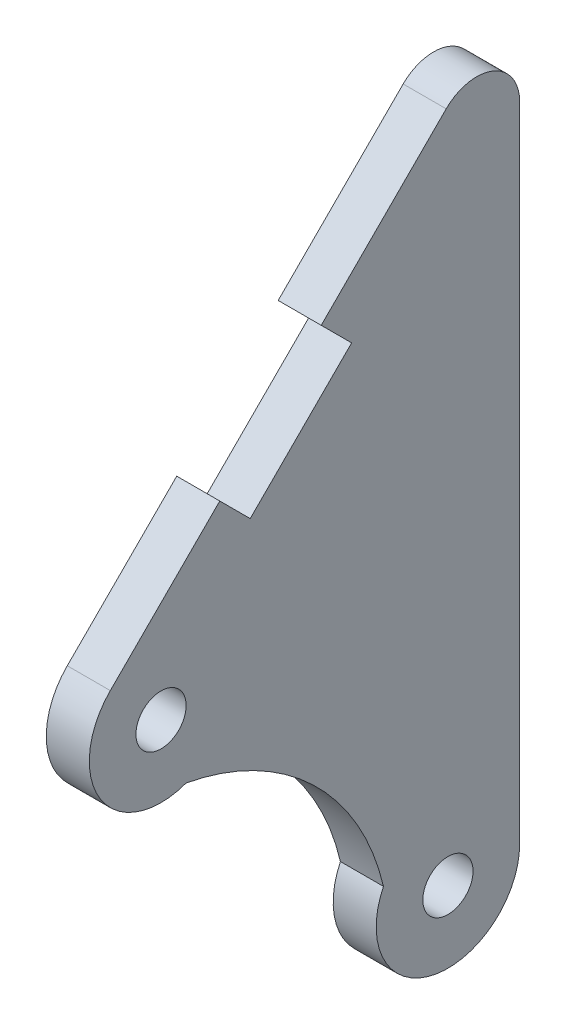
ISO-10303-21;
HEADER;
FILE_DESCRIPTION(('STEP AP214'),'2;1');
FILE_NAME('part.step','',(''),(''),'','','');
FILE_SCHEMA(('AUTOMOTIVE_DESIGN { 1 0 10303 214 1 1 1 1 }'));
ENDSEC;
DATA;
#1=APPLICATION_CONTEXT('core data for automotive mechanical design processes');
#2=APPLICATION_PROTOCOL_DEFINITION('international standard','automotive_design',2000,#1);
#3=PRODUCT_CONTEXT('',#1,'mechanical');
#4=PRODUCT('Part','Part','',(#3));
#5=PRODUCT_RELATED_PRODUCT_CATEGORY('part','',(#4));
#6=PRODUCT_DEFINITION_FORMATION('','',#4);
#7=PRODUCT_DEFINITION_CONTEXT('part definition',#1,'design');
#8=PRODUCT_DEFINITION('design','',#6,#7);
#9=PRODUCT_DEFINITION_SHAPE('','',#8);
#10=(LENGTH_UNIT() NAMED_UNIT(*) SI_UNIT(.MILLI.,.METRE.));
#11=(NAMED_UNIT(*) PLANE_ANGLE_UNIT() SI_UNIT($,.RADIAN.));
#12=(NAMED_UNIT(*) SI_UNIT($,.STERADIAN.) SOLID_ANGLE_UNIT());
#13=UNCERTAINTY_MEASURE_WITH_UNIT(LENGTH_MEASURE(1.E-05),#10,'distance_accuracy_value','');
#14=(GEOMETRIC_REPRESENTATION_CONTEXT(3) GLOBAL_UNCERTAINTY_ASSIGNED_CONTEXT((#13)) GLOBAL_UNIT_ASSIGNED_CONTEXT((#10,
#11,#12)) REPRESENTATION_CONTEXT('',''));
#15=CARTESIAN_POINT('',(0.,0.,0.));
#16=DIRECTION('',(0.,0.,1.));
#17=DIRECTION('',(1.,0.,0.));
#18=AXIS2_PLACEMENT_3D('',#15,#16,#17);
#19=CARTESIAN_POINT('',(3.,20.,20.));
#20=DIRECTION('',(1.,0.,0.));
#21=DIRECTION('',(0.,0.,-1.));
#22=AXIS2_PLACEMENT_3D('',#19,#20,#21);
#23=PLANE('',#22);
#24=CARTESIAN_POINT('',(3.,0.,0.));
#25=DIRECTION('',(1.,0.,0.));
#26=DIRECTION('',(0.,0.,-1.));
#27=AXIS2_PLACEMENT_3D('',#24,#25,#26);
#28=CIRCLE('',#27,1.75);
#29=CARTESIAN_POINT('',(3.,0.,-1.75));
#30=VERTEX_POINT('',#29);
#31=EDGE_CURVE('E145',#30,#30,#28,.T.);
#32=ORIENTED_EDGE('',*,*,#31,.F.);
#33=EDGE_LOOP('',(#32));
#34=FACE_BOUND('',#33,.T.);
#35=CARTESIAN_POINT('',(3.,20.,20.));
#36=DIRECTION('',(1.,0.,0.));
#37=DIRECTION('',(0.,0.,-1.));
#38=AXIS2_PLACEMENT_3D('',#35,#36,#37);
#39=CIRCLE('',#38,5.);
#40=CARTESIAN_POINT('',(3.,23.5355339059327,23.5355339059328));
#41=VERTEX_POINT('',#40);
#42=CARTESIAN_POINT('',(3.,15.3140869019712,18.255804357957));
#43=VERTEX_POINT('',#42);
#44=EDGE_CURVE('E160',#41,#43,#39,.T.);
#45=ORIENTED_EDGE('',*,*,#44,.T.);
#46=CARTESIAN_POINT('',(3.,-1.81136084238303,21.4472512237101));
#47=DIRECTION('',(-1.,0.,0.));
#48=DIRECTION('',(0.,0.,1.));
#49=AXIS2_PLACEMENT_3D('',#46,#47,#48);
#50=CIRCLE('',#49,17.4202839684528);
#51=CARTESIAN_POINT('',(3.,2.19294795151884,4.49343735707191));
#52=VERTEX_POINT('',#51);
#53=EDGE_CURVE('E98',#43,#52,#50,.T.);
#54=ORIENTED_EDGE('',*,*,#53,.T.);
#55=CARTESIAN_POINT('',(3.,0.,0.));
#56=DIRECTION('',(1.,0.,0.));
#57=DIRECTION('',(0.,0.,-1.));
#58=AXIS2_PLACEMENT_3D('',#55,#56,#57);
#59=CIRCLE('',#58,5.);
#60=CARTESIAN_POINT('',(3.,0.,-5.));
#61=VERTEX_POINT('',#60);
#62=EDGE_CURVE('E181',#52,#61,#59,.T.);
#63=ORIENTED_EDGE('',*,*,#62,.T.);
#64=DIRECTION('',(0.,1.,0.));
#65=VECTOR('',#64,1.);
#66=CARTESIAN_POINT('',(3.,44.8284271247464,-5.));
#67=LINE('',#66,#65);
#68=CARTESIAN_POINT('',(3.,44.8284271247464,-5.));
#69=VERTEX_POINT('',#68);
#70=EDGE_CURVE('E200',#61,#69,#67,.T.);
#71=ORIENTED_EDGE('',*,*,#70,.T.);
#72=CARTESIAN_POINT('',(3.,44.8284271247464,-2.));
#73=DIRECTION('',(1.,0.,0.));
#74=DIRECTION('',(0.,0.,-1.));
#75=AXIS2_PLACEMENT_3D('',#72,#73,#74);
#76=CIRCLE('',#75,3.00000000000001);
#77=CARTESIAN_POINT('',(3.,46.9497474683061,0.121320343559651));
#78=VERTEX_POINT('',#77);
#79=EDGE_CURVE('E197',#69,#78,#76,.T.);
#80=ORIENTED_EDGE('',*,*,#79,.T.);
#81=DIRECTION('',(0.,-0.707106781186552,0.707106781186543));
#82=VECTOR('',#81,1.);
#83=CARTESIAN_POINT('',(3.,38.2371973138897,8.83387049797595));
#84=LINE('',#83,#82);
#85=CARTESIAN_POINT('',(3.,38.2371973138897,8.83387049797595));
#86=VERTEX_POINT('',#85);
#87=EDGE_CURVE('E199',#78,#86,#84,.T.);
#88=ORIENTED_EDGE('',*,*,#87,.T.);
#89=DIRECTION('',(0.,-0.707106781186549,-0.707106781186547));
#90=VECTOR('',#89,1.);
#91=CARTESIAN_POINT('',(3.,36.11587697033,6.71255015441624));
#92=LINE('',#91,#90);
#93=CARTESIAN_POINT('',(3.,36.11587697033,6.71255015441624));
#94=VERTEX_POINT('',#93);
#95=EDGE_CURVE('E123',#86,#94,#92,.T.);
#96=ORIENTED_EDGE('',*,*,#95,.T.);
#97=DIRECTION('',(0.,-0.707106781186547,0.707106781186548));
#98=VECTOR('',#97,1.);
#99=CARTESIAN_POINT('',(3.,29.0448091584645,13.7836179662817));
#100=LINE('',#99,#98);
#101=CARTESIAN_POINT('',(3.,29.0448091584645,13.7836179662817));
#102=VERTEX_POINT('',#101);
#103=EDGE_CURVE('E117',#94,#102,#100,.T.);
#104=ORIENTED_EDGE('',*,*,#103,.T.);
#105=DIRECTION('',(0.,0.707106781186548,0.707106781186548));
#106=VECTOR('',#105,1.);
#107=CARTESIAN_POINT('',(3.,29.0448091584645,13.7836179662817));
#108=LINE('',#107,#106);
#109=CARTESIAN_POINT('',(3.,31.1661295020242,15.9049383098414));
#110=VERTEX_POINT('',#109);
#111=EDGE_CURVE('E121',#102,#110,#108,.T.);
#112=ORIENTED_EDGE('',*,*,#111,.T.);
#113=DIRECTION('',(0.,-0.707106781186551,0.707106781186544));
#114=VECTOR('',#113,1.);
#115=CARTESIAN_POINT('',(3.,23.5355339059327,23.5355339059328));
#116=LINE('',#115,#114);
#117=EDGE_CURVE('E49',#110,#41,#116,.T.);
#118=ORIENTED_EDGE('',*,*,#117,.T.);
#119=EDGE_LOOP('',(#45,#54,#63,#71,#80,#88,#96,#104,#112,#118));
#120=FACE_BOUND('',#119,.T.);
#121=CARTESIAN_POINT('',(3.,20.,20.));
#122=DIRECTION('',(1.,0.,0.));
#123=DIRECTION('',(0.,0.,-1.));
#124=AXIS2_PLACEMENT_3D('',#121,#122,#123);
#125=CIRCLE('',#124,1.75);
#126=CARTESIAN_POINT('',(3.,20.,18.25));
#127=VERTEX_POINT('',#126);
#128=EDGE_CURVE('E211',#127,#127,#125,.T.);
#129=ORIENTED_EDGE('',*,*,#128,.F.);
#130=EDGE_LOOP('',(#129));
#131=FACE_BOUND('',#130,.T.);
#132=ADVANCED_FACE('F32',(#34,#120,#131),#23,.T.);
#133=CARTESIAN_POINT('',(0.,20.,20.));
#134=DIRECTION('',(1.,0.,0.));
#135=DIRECTION('',(0.,0.,-1.));
#136=AXIS2_PLACEMENT_3D('',#133,#134,#135);
#137=PLANE('',#136);
#138=CARTESIAN_POINT('',(0.,0.,0.));
#139=DIRECTION('',(1.,0.,0.));
#140=DIRECTION('',(0.,0.,-1.));
#141=AXIS2_PLACEMENT_3D('',#138,#139,#140);
#142=CIRCLE('',#141,1.75);
#143=CARTESIAN_POINT('',(0.,0.,-1.75));
#144=VERTEX_POINT('',#143);
#145=EDGE_CURVE('E208',#144,#144,#142,.T.);
#146=ORIENTED_EDGE('',*,*,#145,.T.);
#147=EDGE_LOOP('',(#146));
#148=FACE_BOUND('',#147,.T.);
#149=CARTESIAN_POINT('',(0.,20.,20.));
#150=DIRECTION('',(1.,0.,0.));
#151=DIRECTION('',(0.,0.,-1.));
#152=AXIS2_PLACEMENT_3D('',#149,#150,#151);
#153=CIRCLE('',#152,5.);
#154=CARTESIAN_POINT('',(0.,23.5355339059327,23.5355339059328));
#155=VERTEX_POINT('',#154);
#156=CARTESIAN_POINT('',(0.,15.3140869019712,18.255804357957));
#157=VERTEX_POINT('',#156);
#158=EDGE_CURVE('E141',#155,#157,#153,.T.);
#159=ORIENTED_EDGE('',*,*,#158,.F.);
#160=DIRECTION('',(0.,-0.707106781186551,0.707106781186544));
#161=VECTOR('',#160,1.);
#162=CARTESIAN_POINT('',(0.,23.5355339059327,23.5355339059328));
#163=LINE('',#162,#161);
#164=CARTESIAN_POINT('',(0.,31.1661295020242,15.9049383098414));
#165=VERTEX_POINT('',#164);
#166=EDGE_CURVE('E90',#165,#155,#163,.T.);
#167=ORIENTED_EDGE('',*,*,#166,.F.);
#168=DIRECTION('',(0.,0.707106781186548,0.707106781186548));
#169=VECTOR('',#168,1.);
#170=CARTESIAN_POINT('',(0.,29.0448091584645,13.7836179662817));
#171=LINE('',#170,#169);
#172=CARTESIAN_POINT('',(0.,29.0448091584645,13.7836179662817));
#173=VERTEX_POINT('',#172);
#174=EDGE_CURVE('E84',#173,#165,#171,.T.);
#175=ORIENTED_EDGE('',*,*,#174,.F.);
#176=DIRECTION('',(0.,-0.707106781186547,0.707106781186548));
#177=VECTOR('',#176,1.);
#178=CARTESIAN_POINT('',(0.,29.0448091584645,13.7836179662817));
#179=LINE('',#178,#177);
#180=CARTESIAN_POINT('',(0.,36.11587697033,6.71255015441624));
#181=VERTEX_POINT('',#180);
#182=EDGE_CURVE('E131',#181,#173,#179,.T.);
#183=ORIENTED_EDGE('',*,*,#182,.F.);
#184=DIRECTION('',(0.,-0.707106781186549,-0.707106781186547));
#185=VECTOR('',#184,1.);
#186=CARTESIAN_POINT('',(0.,36.11587697033,6.71255015441624));
#187=LINE('',#186,#185);
#188=CARTESIAN_POINT('',(0.,38.2371973138897,8.83387049797595));
#189=VERTEX_POINT('',#188);
#190=EDGE_CURVE('E155',#189,#181,#187,.T.);
#191=ORIENTED_EDGE('',*,*,#190,.F.);
#192=DIRECTION('',(0.,-0.707106781186552,0.707106781186543));
#193=VECTOR('',#192,1.);
#194=CARTESIAN_POINT('',(0.,38.2371973138897,8.83387049797595));
#195=LINE('',#194,#193);
#196=CARTESIAN_POINT('',(0.,46.9497474683061,0.121320343559651));
#197=VERTEX_POINT('',#196);
#198=EDGE_CURVE('E153',#197,#189,#195,.T.);
#199=ORIENTED_EDGE('',*,*,#198,.F.);
#200=CARTESIAN_POINT('',(0.,44.8284271247464,-2.));
#201=DIRECTION('',(1.,0.,0.));
#202=DIRECTION('',(0.,0.,-1.));
#203=AXIS2_PLACEMENT_3D('',#200,#201,#202);
#204=CIRCLE('',#203,3.00000000000001);
#205=CARTESIAN_POINT('',(0.,44.8284271247464,-5.));
#206=VERTEX_POINT('',#205);
#207=EDGE_CURVE('E151',#206,#197,#204,.T.);
#208=ORIENTED_EDGE('',*,*,#207,.F.);
#209=DIRECTION('',(0.,1.,0.));
#210=VECTOR('',#209,1.);
#211=CARTESIAN_POINT('',(0.,44.8284271247464,-5.));
#212=LINE('',#211,#210);
#213=CARTESIAN_POINT('',(0.,0.,-5.));
#214=VERTEX_POINT('',#213);
#215=EDGE_CURVE('E149',#214,#206,#212,.T.);
#216=ORIENTED_EDGE('',*,*,#215,.F.);
#217=CARTESIAN_POINT('',(0.,0.,0.));
#218=DIRECTION('',(1.,0.,0.));
#219=DIRECTION('',(0.,0.,-1.));
#220=AXIS2_PLACEMENT_3D('',#217,#218,#219);
#221=CIRCLE('',#220,5.);
#222=CARTESIAN_POINT('',(0.,2.19294795151884,4.49343735707191));
#223=VERTEX_POINT('',#222);
#224=EDGE_CURVE('E147',#223,#214,#221,.T.);
#225=ORIENTED_EDGE('',*,*,#224,.F.);
#226=CARTESIAN_POINT('',(0.,-1.81136084238303,21.4472512237101));
#227=DIRECTION('',(-1.,0.,0.));
#228=DIRECTION('',(0.,0.,1.));
#229=AXIS2_PLACEMENT_3D('',#226,#227,#228);
#230=CIRCLE('',#229,17.4202839684528);
#231=EDGE_CURVE('E144',#157,#223,#230,.T.);
#232=ORIENTED_EDGE('',*,*,#231,.F.);
#233=EDGE_LOOP('',(#159,#167,#175,#183,#191,#199,#208,#216,#225,#232));
#234=FACE_BOUND('',#233,.T.);
#235=CARTESIAN_POINT('',(0.,20.,20.));
#236=DIRECTION('',(1.,0.,0.));
#237=DIRECTION('',(0.,0.,-1.));
#238=AXIS2_PLACEMENT_3D('',#235,#236,#237);
#239=CIRCLE('',#238,1.75);
#240=CARTESIAN_POINT('',(0.,20.,18.25));
#241=VERTEX_POINT('',#240);
#242=EDGE_CURVE('E214',#241,#241,#239,.T.);
#243=ORIENTED_EDGE('',*,*,#242,.T.);
#244=EDGE_LOOP('',(#243));
#245=FACE_BOUND('',#244,.T.);
#246=ADVANCED_FACE('F185',(#148,#234,#245),#137,.F.);
#247=CARTESIAN_POINT('',(3.,20.,20.));
#248=DIRECTION('',(-1.,0.,0.));
#249=DIRECTION('',(0.,0.,1.));
#250=AXIS2_PLACEMENT_3D('',#247,#248,#249);
#251=CYLINDRICAL_SURFACE('',#250,5.);
#252=ORIENTED_EDGE('',*,*,#158,.T.);
#253=DIRECTION('',(-1.,0.,0.));
#254=VECTOR('',#253,1.);
#255=CARTESIAN_POINT('',(3.,15.3140869019712,18.255804357957));
#256=LINE('',#255,#254);
#257=EDGE_CURVE('E11',#43,#157,#256,.T.);
#258=ORIENTED_EDGE('',*,*,#257,.F.);
#259=ORIENTED_EDGE('',*,*,#44,.F.);
#260=DIRECTION('',(-1.,0.,0.));
#261=VECTOR('',#260,1.);
#262=CARTESIAN_POINT('',(3.,23.5355339059327,23.5355339059328));
#263=LINE('',#262,#261);
#264=EDGE_CURVE('E137',#41,#155,#263,.T.);
#265=ORIENTED_EDGE('',*,*,#264,.T.);
#266=EDGE_LOOP('',(#252,#258,#259,#265));
#267=FACE_BOUND('',#266,.T.);
#268=ADVANCED_FACE('F34',(#267),#251,.T.);
#269=CARTESIAN_POINT('',(3.,-1.81136084238303,21.4472512237101));
#270=DIRECTION('',(-1.,0.,0.));
#271=DIRECTION('',(0.,0.,1.));
#272=AXIS2_PLACEMENT_3D('',#269,#270,#271);
#273=CYLINDRICAL_SURFACE('',#272,17.4202839684528);
#274=ORIENTED_EDGE('',*,*,#231,.T.);
#275=DIRECTION('',(-1.,0.,0.));
#276=VECTOR('',#275,1.);
#277=CARTESIAN_POINT('',(3.,2.19294795151884,4.49343735707191));
#278=LINE('',#277,#276);
#279=EDGE_CURVE('E41',#52,#223,#278,.T.);
#280=ORIENTED_EDGE('',*,*,#279,.F.);
#281=ORIENTED_EDGE('',*,*,#53,.F.);
#282=ORIENTED_EDGE('',*,*,#257,.T.);
#283=EDGE_LOOP('',(#274,#280,#281,#282));
#284=FACE_BOUND('',#283,.T.);
#285=ADVANCED_FACE('F255',(#284),#273,.F.);
#286=CARTESIAN_POINT('',(3.,0.,0.));
#287=DIRECTION('',(-1.,0.,0.));
#288=DIRECTION('',(0.,0.,1.));
#289=AXIS2_PLACEMENT_3D('',#286,#287,#288);
#290=CYLINDRICAL_SURFACE('',#289,5.);
#291=ORIENTED_EDGE('',*,*,#224,.T.);
#292=DIRECTION('',(-1.,0.,0.));
#293=VECTOR('',#292,1.);
#294=CARTESIAN_POINT('',(3.,0.,-5.));
#295=LINE('',#294,#293);
#296=EDGE_CURVE('E173',#61,#214,#295,.T.);
#297=ORIENTED_EDGE('',*,*,#296,.F.);
#298=ORIENTED_EDGE('',*,*,#62,.F.);
#299=ORIENTED_EDGE('',*,*,#279,.T.);
#300=EDGE_LOOP('',(#291,#297,#298,#299));
#301=FACE_BOUND('',#300,.T.);
#302=ADVANCED_FACE('F179',(#301),#290,.T.);
#303=CARTESIAN_POINT('',(3.,44.8284271247464,-5.));
#304=DIRECTION('',(0.,0.,1.));
#305=DIRECTION('',(0.,-1.,0.));
#306=AXIS2_PLACEMENT_3D('',#303,#304,#305);
#307=PLANE('',#306);
#308=ORIENTED_EDGE('',*,*,#215,.T.);
#309=DIRECTION('',(-1.,0.,0.));
#310=VECTOR('',#309,1.);
#311=CARTESIAN_POINT('',(3.,44.8284271247464,-5.));
#312=LINE('',#311,#310);
#313=EDGE_CURVE('E170',#69,#206,#312,.T.);
#314=ORIENTED_EDGE('',*,*,#313,.F.);
#315=ORIENTED_EDGE('',*,*,#70,.F.);
#316=ORIENTED_EDGE('',*,*,#296,.T.);
#317=EDGE_LOOP('',(#308,#314,#315,#316));
#318=FACE_BOUND('',#317,.T.);
#319=ADVANCED_FACE('F191',(#318),#307,.F.);
#320=CARTESIAN_POINT('',(3.,44.8284271247464,-2.));
#321=DIRECTION('',(-1.,0.,0.));
#322=DIRECTION('',(0.,0.,1.));
#323=AXIS2_PLACEMENT_3D('',#320,#321,#322);
#324=CYLINDRICAL_SURFACE('',#323,3.00000000000001);
#325=ORIENTED_EDGE('',*,*,#207,.T.);
#326=DIRECTION('',(-1.,0.,0.));
#327=VECTOR('',#326,1.);
#328=CARTESIAN_POINT('',(3.,46.9497474683061,0.121320343559651));
#329=LINE('',#328,#327);
#330=EDGE_CURVE('E167',#78,#197,#329,.T.);
#331=ORIENTED_EDGE('',*,*,#330,.F.);
#332=ORIENTED_EDGE('',*,*,#79,.F.);
#333=ORIENTED_EDGE('',*,*,#313,.T.);
#334=EDGE_LOOP('',(#325,#331,#332,#333));
#335=FACE_BOUND('',#334,.T.);
#336=ADVANCED_FACE('F195',(#335),#324,.T.);
#337=CARTESIAN_POINT('',(3.,38.2371973138897,8.83387049797595));
#338=DIRECTION('',(0.,-0.707106781186543,-0.707106781186552));
#339=DIRECTION('',(0.,0.707106781186552,-0.707106781186543));
#340=AXIS2_PLACEMENT_3D('',#337,#338,#339);
#341=PLANE('',#340);
#342=ORIENTED_EDGE('',*,*,#198,.T.);
#343=DIRECTION('',(-1.,0.,0.));
#344=VECTOR('',#343,1.);
#345=CARTESIAN_POINT('',(3.,38.2371973138897,8.83387049797595));
#346=LINE('',#345,#344);
#347=EDGE_CURVE('E164',#86,#189,#346,.T.);
#348=ORIENTED_EDGE('',*,*,#347,.F.);
#349=ORIENTED_EDGE('',*,*,#87,.F.);
#350=ORIENTED_EDGE('',*,*,#330,.T.);
#351=EDGE_LOOP('',(#342,#348,#349,#350));
#352=FACE_BOUND('',#351,.T.);
#353=ADVANCED_FACE('F245',(#352),#341,.F.);
#354=CARTESIAN_POINT('',(3.,36.11587697033,6.71255015441624));
#355=DIRECTION('',(0.,0.707106781186546,-0.707106781186548));
#356=DIRECTION('',(0.,0.707106781186549,0.707106781186547));
#357=AXIS2_PLACEMENT_3D('',#354,#355,#356);
#358=PLANE('',#357);
#359=ORIENTED_EDGE('',*,*,#190,.T.);
#360=DIRECTION('',(-1.,0.,0.));
#361=VECTOR('',#360,1.);
#362=CARTESIAN_POINT('',(3.,36.11587697033,6.71255015441624));
#363=LINE('',#362,#361);
#364=EDGE_CURVE('E132',#94,#181,#363,.T.);
#365=ORIENTED_EDGE('',*,*,#364,.F.);
#366=ORIENTED_EDGE('',*,*,#95,.F.);
#367=ORIENTED_EDGE('',*,*,#347,.T.);
#368=EDGE_LOOP('',(#359,#365,#366,#367));
#369=FACE_BOUND('',#368,.T.);
#370=ADVANCED_FACE('F242',(#369),#358,.F.);
#371=CARTESIAN_POINT('',(3.,29.0448091584645,13.7836179662817));
#372=DIRECTION('',(0.,-0.707106781186548,-0.707106781186547));
#373=DIRECTION('',(0.,0.707106781186547,-0.707106781186548));
#374=AXIS2_PLACEMENT_3D('',#371,#372,#373);
#375=PLANE('',#374);
#376=ORIENTED_EDGE('',*,*,#182,.T.);
#377=DIRECTION('',(-1.,0.,0.));
#378=VECTOR('',#377,1.);
#379=CARTESIAN_POINT('',(3.,29.0448091584645,13.7836179662817));
#380=LINE('',#379,#378);
#381=EDGE_CURVE('E128',#102,#173,#380,.T.);
#382=ORIENTED_EDGE('',*,*,#381,.F.);
#383=ORIENTED_EDGE('',*,*,#103,.F.);
#384=ORIENTED_EDGE('',*,*,#364,.T.);
#385=EDGE_LOOP('',(#376,#382,#383,#384));
#386=FACE_BOUND('',#385,.T.);
#387=ADVANCED_FACE('F129',(#386),#375,.F.);
#388=CARTESIAN_POINT('',(3.,29.0448091584645,13.7836179662817));
#389=DIRECTION('',(0.,-0.707106781186547,0.707106781186547));
#390=DIRECTION('',(0.,-0.707106781186548,-0.707106781186548));
#391=AXIS2_PLACEMENT_3D('',#388,#389,#390);
#392=PLANE('',#391);
#393=ORIENTED_EDGE('',*,*,#174,.T.);
#394=DIRECTION('',(-1.,0.,0.));
#395=VECTOR('',#394,1.);
#396=CARTESIAN_POINT('',(3.,31.1661295020242,15.9049383098414));
#397=LINE('',#396,#395);
#398=EDGE_CURVE('E133',#110,#165,#397,.T.);
#399=ORIENTED_EDGE('',*,*,#398,.F.);
#400=ORIENTED_EDGE('',*,*,#111,.F.);
#401=ORIENTED_EDGE('',*,*,#381,.T.);
#402=EDGE_LOOP('',(#393,#399,#400,#401));
#403=FACE_BOUND('',#402,.T.);
#404=ADVANCED_FACE('F135',(#403),#392,.F.);
#405=CARTESIAN_POINT('',(3.,23.5355339059327,23.5355339059328));
#406=DIRECTION('',(0.,-0.707106781186544,-0.70710678118655));
#407=DIRECTION('',(0.,0.707106781186551,-0.707106781186545));
#408=AXIS2_PLACEMENT_3D('',#405,#406,#407);
#409=PLANE('',#408);
#410=ORIENTED_EDGE('',*,*,#166,.T.);
#411=ORIENTED_EDGE('',*,*,#264,.F.);
#412=ORIENTED_EDGE('',*,*,#117,.F.);
#413=ORIENTED_EDGE('',*,*,#398,.T.);
#414=EDGE_LOOP('',(#410,#411,#412,#413));
#415=FACE_BOUND('',#414,.T.);
#416=ADVANCED_FACE('F235',(#415),#409,.F.);
#417=CARTESIAN_POINT('',(3.,0.,0.));
#418=DIRECTION('',(-1.,0.,0.));
#419=DIRECTION('',(0.,0.,1.));
#420=AXIS2_PLACEMENT_3D('',#417,#418,#419);
#421=CYLINDRICAL_SURFACE('',#420,1.75);
#422=ORIENTED_EDGE('',*,*,#31,.T.);
#423=EDGE_LOOP('',(#422));
#424=FACE_BOUND('',#423,.T.);
#425=ORIENTED_EDGE('',*,*,#145,.F.);
#426=EDGE_LOOP('',(#425));
#427=FACE_BOUND('',#426,.T.);
#428=ADVANCED_FACE('F232',(#424,#427),#421,.F.);
#429=CARTESIAN_POINT('',(3.,20.,20.));
#430=DIRECTION('',(-1.,0.,0.));
#431=DIRECTION('',(0.,0.,1.));
#432=AXIS2_PLACEMENT_3D('',#429,#430,#431);
#433=CYLINDRICAL_SURFACE('',#432,1.75);
#434=ORIENTED_EDGE('',*,*,#128,.T.);
#435=EDGE_LOOP('',(#434));
#436=FACE_BOUND('',#435,.T.);
#437=ORIENTED_EDGE('',*,*,#242,.F.);
#438=EDGE_LOOP('',(#437));
#439=FACE_BOUND('',#438,.T.);
#440=ADVANCED_FACE('F220',(#436,#439),#433,.F.);
#441=CLOSED_SHELL('',(#132,#246,#268,#285,#302,#319,#336,#353,#370,#387,#404,#416,#428,#440));
#442=MANIFOLD_SOLID_BREP('B2',#441);
#443=ADVANCED_BREP_SHAPE_REPRESENTATION('',(#18,#442),#14);
#444=SHAPE_DEFINITION_REPRESENTATION(#9,#443);
ENDSEC;
END-ISO-10303-21;
